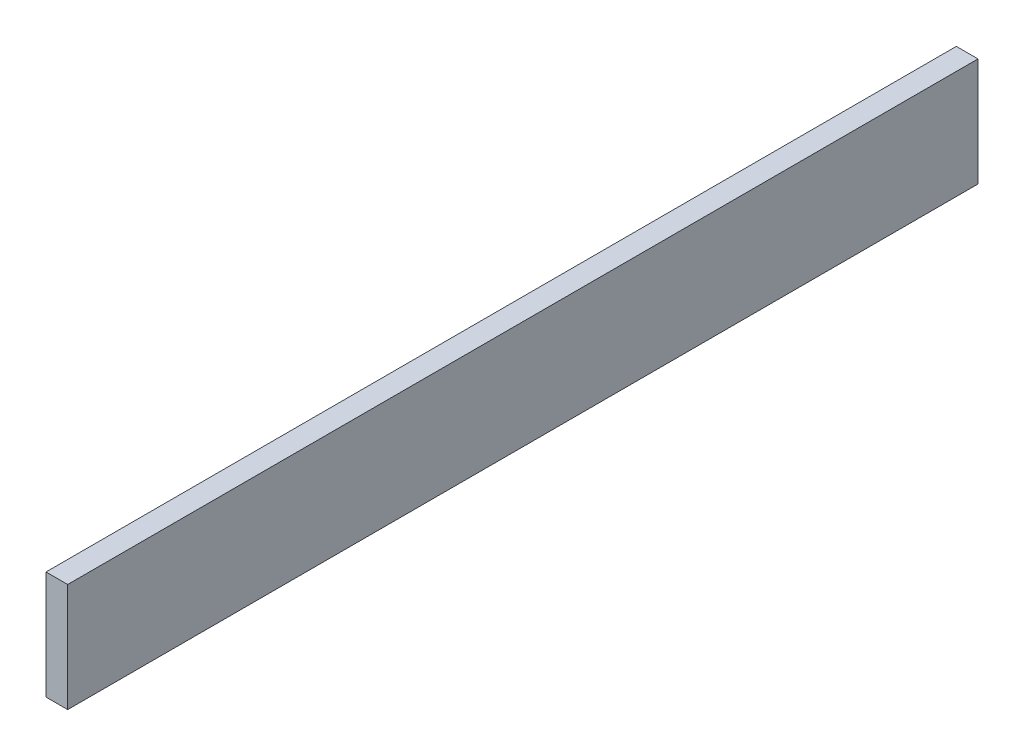
ISO-10303-21;
HEADER;
FILE_DESCRIPTION(('STEP AP214'),'2;1');
FILE_NAME('part.step','',(''),(''),'','','');
FILE_SCHEMA(('AUTOMOTIVE_DESIGN { 1 0 10303 214 1 1 1 1 }'));
ENDSEC;
DATA;
#1=APPLICATION_CONTEXT('core data for automotive mechanical design processes');
#2=APPLICATION_PROTOCOL_DEFINITION('international standard','automotive_design',2000,#1);
#3=PRODUCT_CONTEXT('',#1,'mechanical');
#4=PRODUCT('Part','Part','',(#3));
#5=PRODUCT_RELATED_PRODUCT_CATEGORY('part','',(#4));
#6=PRODUCT_DEFINITION_FORMATION('','',#4);
#7=PRODUCT_DEFINITION_CONTEXT('part definition',#1,'design');
#8=PRODUCT_DEFINITION('design','',#6,#7);
#9=PRODUCT_DEFINITION_SHAPE('','',#8);
#10=(LENGTH_UNIT() NAMED_UNIT(*) SI_UNIT(.MILLI.,.METRE.));
#11=(NAMED_UNIT(*) PLANE_ANGLE_UNIT() SI_UNIT($,.RADIAN.));
#12=(NAMED_UNIT(*) SI_UNIT($,.STERADIAN.) SOLID_ANGLE_UNIT());
#13=UNCERTAINTY_MEASURE_WITH_UNIT(LENGTH_MEASURE(1.E-05),#10,'distance_accuracy_value','');
#14=(GEOMETRIC_REPRESENTATION_CONTEXT(3) GLOBAL_UNCERTAINTY_ASSIGNED_CONTEXT((#13)) GLOBAL_UNIT_ASSIGNED_CONTEXT((#10,
#11,#12)) REPRESENTATION_CONTEXT('',''));
#15=CARTESIAN_POINT('',(0.,0.,0.));
#16=DIRECTION('',(0.,0.,1.));
#17=DIRECTION('',(1.,0.,0.));
#18=AXIS2_PLACEMENT_3D('',#15,#16,#17);
#19=CARTESIAN_POINT('',(3.,-7.5,-63.));
#20=DIRECTION('',(0.,0.,1.));
#21=DIRECTION('',(1.,0.,0.));
#22=AXIS2_PLACEMENT_3D('',#19,#20,#21);
#23=PLANE('',#22);
#24=DIRECTION('',(0.,1.,0.));
#25=VECTOR('',#24,1.);
#26=CARTESIAN_POINT('',(0.,-7.5,-63.));
#27=LINE('',#26,#25);
#28=CARTESIAN_POINT('',(0.,-7.5,-63.));
#29=VERTEX_POINT('',#28);
#30=CARTESIAN_POINT('',(0.,7.5,-63.));
#31=VERTEX_POINT('',#30);
#32=EDGE_CURVE('E96',#29,#31,#27,.T.);
#33=ORIENTED_EDGE('',*,*,#32,.T.);
#34=DIRECTION('',(-1.,0.,0.));
#35=VECTOR('',#34,1.);
#36=CARTESIAN_POINT('',(3.,7.5,-63.));
#37=LINE('',#36,#35);
#38=CARTESIAN_POINT('',(3.,7.5,-63.));
#39=VERTEX_POINT('',#38);
#40=EDGE_CURVE('E11',#39,#31,#37,.T.);
#41=ORIENTED_EDGE('',*,*,#40,.F.);
#42=DIRECTION('',(0.,1.,0.));
#43=VECTOR('',#42,1.);
#44=CARTESIAN_POINT('',(3.,-7.5,-63.));
#45=LINE('',#44,#43);
#46=CARTESIAN_POINT('',(3.,-7.5,-63.));
#47=VERTEX_POINT('',#46);
#48=EDGE_CURVE('E84',#47,#39,#45,.T.);
#49=ORIENTED_EDGE('',*,*,#48,.F.);
#50=DIRECTION('',(-1.,0.,0.));
#51=VECTOR('',#50,1.);
#52=CARTESIAN_POINT('',(3.,-7.5,-63.));
#53=LINE('',#52,#51);
#54=EDGE_CURVE('E92',#47,#29,#53,.T.);
#55=ORIENTED_EDGE('',*,*,#54,.T.);
#56=EDGE_LOOP('',(#33,#41,#49,#55));
#57=FACE_BOUND('',#56,.T.);
#58=ADVANCED_FACE('F33',(#57),#23,.F.);
#59=CARTESIAN_POINT('',(3.,7.5,63.));
#60=DIRECTION('',(0.,-1.,0.));
#61=DIRECTION('',(0.,0.,-1.));
#62=AXIS2_PLACEMENT_3D('',#59,#60,#61);
#63=PLANE('',#62);
#64=DIRECTION('',(0.,0.,1.));
#65=VECTOR('',#64,1.);
#66=CARTESIAN_POINT('',(0.,7.5,63.));
#67=LINE('',#66,#65);
#68=CARTESIAN_POINT('',(0.,7.5,63.));
#69=VERTEX_POINT('',#68);
#70=EDGE_CURVE('E88',#31,#69,#67,.T.);
#71=ORIENTED_EDGE('',*,*,#70,.T.);
#72=DIRECTION('',(-1.,0.,0.));
#73=VECTOR('',#72,1.);
#74=CARTESIAN_POINT('',(3.,7.5,63.));
#75=LINE('',#74,#73);
#76=CARTESIAN_POINT('',(3.,7.5,63.));
#77=VERTEX_POINT('',#76);
#78=EDGE_CURVE('E41',#77,#69,#75,.T.);
#79=ORIENTED_EDGE('',*,*,#78,.F.);
#80=DIRECTION('',(0.,0.,1.));
#81=VECTOR('',#80,1.);
#82=CARTESIAN_POINT('',(3.,7.5,63.));
#83=LINE('',#82,#81);
#84=EDGE_CURVE('E79',#39,#77,#83,.T.);
#85=ORIENTED_EDGE('',*,*,#84,.F.);
#86=ORIENTED_EDGE('',*,*,#40,.T.);
#87=EDGE_LOOP('',(#71,#79,#85,#86));
#88=FACE_BOUND('',#87,.T.);
#89=ADVANCED_FACE('F87',(#88),#63,.F.);
#90=CARTESIAN_POINT('',(3.,-7.5,63.));
#91=DIRECTION('',(0.,0.,-1.));
#92=DIRECTION('',(-1.,0.,0.));
#93=AXIS2_PLACEMENT_3D('',#90,#91,#92);
#94=PLANE('',#93);
#95=DIRECTION('',(0.,-1.,0.));
#96=VECTOR('',#95,1.);
#97=CARTESIAN_POINT('',(0.,-7.5,63.));
#98=LINE('',#97,#96);
#99=CARTESIAN_POINT('',(0.,-7.5,63.));
#100=VERTEX_POINT('',#99);
#101=EDGE_CURVE('E66',#69,#100,#98,.T.);
#102=ORIENTED_EDGE('',*,*,#101,.T.);
#103=DIRECTION('',(-1.,0.,0.));
#104=VECTOR('',#103,1.);
#105=CARTESIAN_POINT('',(3.,-7.5,63.));
#106=LINE('',#105,#104);
#107=CARTESIAN_POINT('',(3.,-7.5,63.));
#108=VERTEX_POINT('',#107);
#109=EDGE_CURVE('E89',#108,#100,#106,.T.);
#110=ORIENTED_EDGE('',*,*,#109,.F.);
#111=DIRECTION('',(0.,-1.,0.));
#112=VECTOR('',#111,1.);
#113=CARTESIAN_POINT('',(3.,-7.5,63.));
#114=LINE('',#113,#112);
#115=EDGE_CURVE('E82',#77,#108,#114,.T.);
#116=ORIENTED_EDGE('',*,*,#115,.F.);
#117=ORIENTED_EDGE('',*,*,#78,.T.);
#118=EDGE_LOOP('',(#102,#110,#116,#117));
#119=FACE_BOUND('',#118,.T.);
#120=ADVANCED_FACE('F90',(#119),#94,.F.);
#121=CARTESIAN_POINT('',(3.,-7.5,63.));
#122=DIRECTION('',(0.,1.,0.));
#123=DIRECTION('',(0.,0.,1.));
#124=AXIS2_PLACEMENT_3D('',#121,#122,#123);
#125=PLANE('',#124);
#126=DIRECTION('',(0.,0.,-1.));
#127=VECTOR('',#126,1.);
#128=CARTESIAN_POINT('',(0.,-7.5,63.));
#129=LINE('',#128,#127);
#130=EDGE_CURVE('E72',#100,#29,#129,.T.);
#131=ORIENTED_EDGE('',*,*,#130,.T.);
#132=ORIENTED_EDGE('',*,*,#54,.F.);
#133=DIRECTION('',(0.,0.,-1.));
#134=VECTOR('',#133,1.);
#135=CARTESIAN_POINT('',(3.,-7.5,63.));
#136=LINE('',#135,#134);
#137=EDGE_CURVE('E49',#108,#47,#136,.T.);
#138=ORIENTED_EDGE('',*,*,#137,.F.);
#139=ORIENTED_EDGE('',*,*,#109,.T.);
#140=EDGE_LOOP('',(#131,#132,#138,#139));
#141=FACE_BOUND('',#140,.T.);
#142=ADVANCED_FACE('F103',(#141),#125,.F.);
#143=CARTESIAN_POINT('',(3.,0.,0.));
#144=DIRECTION('',(-1.,0.,0.));
#145=DIRECTION('',(0.,0.,1.));
#146=AXIS2_PLACEMENT_3D('',#143,#144,#145);
#147=PLANE('',#146);
#148=ORIENTED_EDGE('',*,*,#48,.T.);
#149=ORIENTED_EDGE('',*,*,#84,.T.);
#150=ORIENTED_EDGE('',*,*,#115,.T.);
#151=ORIENTED_EDGE('',*,*,#137,.T.);
#152=EDGE_LOOP('',(#148,#149,#150,#151));
#153=FACE_BOUND('',#152,.T.);
#154=ADVANCED_FACE('F80',(#153),#147,.F.);
#155=CARTESIAN_POINT('',(0.,0.,0.));
#156=DIRECTION('',(-1.,0.,0.));
#157=DIRECTION('',(0.,0.,1.));
#158=AXIS2_PLACEMENT_3D('',#155,#156,#157);
#159=PLANE('',#158);
#160=ORIENTED_EDGE('',*,*,#32,.F.);
#161=ORIENTED_EDGE('',*,*,#130,.F.);
#162=ORIENTED_EDGE('',*,*,#101,.F.);
#163=ORIENTED_EDGE('',*,*,#70,.F.);
#164=EDGE_LOOP('',(#160,#161,#162,#163));
#165=FACE_BOUND('',#164,.T.);
#166=ADVANCED_FACE('F106',(#165),#159,.T.);
#167=CLOSED_SHELL('',(#58,#89,#120,#142,#154,#166));
#168=MANIFOLD_SOLID_BREP('B2',#167);
#169=ADVANCED_BREP_SHAPE_REPRESENTATION('',(#18,#168),#14);
#170=SHAPE_DEFINITION_REPRESENTATION(#9,#169);
ENDSEC;
END-ISO-10303-21;
